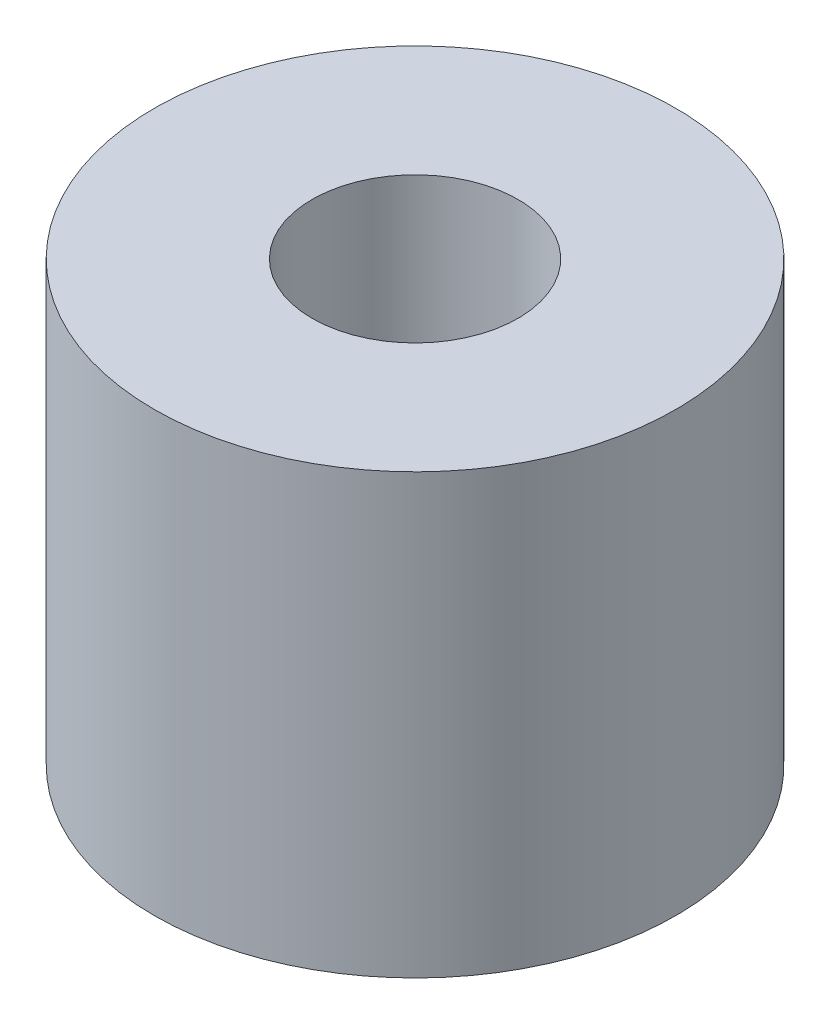
ISO-10303-21;
HEADER;
FILE_DESCRIPTION(('STEP AP214'),'2;1');
FILE_NAME('part.step','',(''),(''),'','','');
FILE_SCHEMA(('AUTOMOTIVE_DESIGN { 1 0 10303 214 1 1 1 1 }'));
ENDSEC;
DATA;
#1=APPLICATION_CONTEXT('core data for automotive mechanical design processes');
#2=APPLICATION_PROTOCOL_DEFINITION('international standard','automotive_design',2000,#1);
#3=PRODUCT_CONTEXT('',#1,'mechanical');
#4=PRODUCT('Part','Part','',(#3));
#5=PRODUCT_RELATED_PRODUCT_CATEGORY('part','',(#4));
#6=PRODUCT_DEFINITION_FORMATION('','',#4);
#7=PRODUCT_DEFINITION_CONTEXT('part definition',#1,'design');
#8=PRODUCT_DEFINITION('design','',#6,#7);
#9=PRODUCT_DEFINITION_SHAPE('','',#8);
#10=(LENGTH_UNIT() NAMED_UNIT(*) SI_UNIT(.MILLI.,.METRE.));
#11=(NAMED_UNIT(*) PLANE_ANGLE_UNIT() SI_UNIT($,.RADIAN.));
#12=(NAMED_UNIT(*) SI_UNIT($,.STERADIAN.) SOLID_ANGLE_UNIT());
#13=UNCERTAINTY_MEASURE_WITH_UNIT(LENGTH_MEASURE(1.E-05),#10,'distance_accuracy_value','');
#14=(GEOMETRIC_REPRESENTATION_CONTEXT(3) GLOBAL_UNCERTAINTY_ASSIGNED_CONTEXT((#13)) GLOBAL_UNIT_ASSIGNED_CONTEXT((#10,
#11,#12)) REPRESENTATION_CONTEXT('',''));
#15=CARTESIAN_POINT('',(0.,0.,0.));
#16=DIRECTION('',(0.,0.,1.));
#17=DIRECTION('',(1.,0.,0.));
#18=AXIS2_PLACEMENT_3D('',#15,#16,#17);
#19=CARTESIAN_POINT('',(0.,5.,0.));
#20=DIRECTION('',(0.,1.,0.));
#21=DIRECTION('',(0.,0.,1.));
#22=AXIS2_PLACEMENT_3D('',#19,#20,#21);
#23=PLANE('',#22);
#24=CARTESIAN_POINT('',(0.,5.,0.));
#25=DIRECTION('',(0.,1.,0.));
#26=DIRECTION('',(0.,0.,1.));
#27=AXIS2_PLACEMENT_3D('',#24,#25,#26);
#28=CIRCLE('',#27,2.975);
#29=CARTESIAN_POINT('',(0.,5.,2.975));
#30=VERTEX_POINT('',#29);
#31=EDGE_CURVE('E10',#30,#30,#28,.T.);
#32=ORIENTED_EDGE('',*,*,#31,.T.);
#33=EDGE_LOOP('',(#32));
#34=FACE_BOUND('',#33,.T.);
#35=CARTESIAN_POINT('',(0.,5.,0.));
#36=DIRECTION('',(0.,1.,0.));
#37=DIRECTION('',(0.,0.,1.));
#38=AXIS2_PLACEMENT_3D('',#35,#36,#37);
#39=CIRCLE('',#38,1.175);
#40=CARTESIAN_POINT('',(0.,5.,1.175));
#41=VERTEX_POINT('',#40);
#42=EDGE_CURVE('E50',#41,#41,#39,.T.);
#43=ORIENTED_EDGE('',*,*,#42,.F.);
#44=EDGE_LOOP('',(#43));
#45=FACE_BOUND('',#44,.T.);
#46=ADVANCED_FACE('F37',(#34,#45),#23,.T.);
#47=CARTESIAN_POINT('',(0.,0.,0.));
#48=DIRECTION('',(0.,1.,0.));
#49=DIRECTION('',(0.,0.,1.));
#50=AXIS2_PLACEMENT_3D('',#47,#48,#49);
#51=PLANE('',#50);
#52=CARTESIAN_POINT('',(0.,0.,0.));
#53=DIRECTION('',(0.,1.,0.));
#54=DIRECTION('',(0.,0.,1.));
#55=AXIS2_PLACEMENT_3D('',#52,#53,#54);
#56=CIRCLE('',#55,2.975);
#57=CARTESIAN_POINT('',(0.,0.,2.975));
#58=VERTEX_POINT('',#57);
#59=EDGE_CURVE('E41',#58,#58,#56,.T.);
#60=ORIENTED_EDGE('',*,*,#59,.F.);
#61=EDGE_LOOP('',(#60));
#62=FACE_BOUND('',#61,.T.);
#63=CARTESIAN_POINT('',(0.,0.,0.));
#64=DIRECTION('',(0.,1.,0.));
#65=DIRECTION('',(0.,0.,1.));
#66=AXIS2_PLACEMENT_3D('',#63,#64,#65);
#67=CIRCLE('',#66,1.175);
#68=CARTESIAN_POINT('',(0.,0.,1.175));
#69=VERTEX_POINT('',#68);
#70=EDGE_CURVE('E52',#69,#69,#67,.T.);
#71=ORIENTED_EDGE('',*,*,#70,.T.);
#72=EDGE_LOOP('',(#71));
#73=FACE_BOUND('',#72,.T.);
#74=ADVANCED_FACE('F64',(#62,#73),#51,.F.);
#75=CARTESIAN_POINT('',(0.,5.,0.));
#76=DIRECTION('',(0.,-1.,0.));
#77=DIRECTION('',(0.,0.,-1.));
#78=AXIS2_PLACEMENT_3D('',#75,#76,#77);
#79=CYLINDRICAL_SURFACE('',#78,2.975);
#80=ORIENTED_EDGE('',*,*,#31,.F.);
#81=EDGE_LOOP('',(#80));
#82=FACE_BOUND('',#81,.T.);
#83=ORIENTED_EDGE('',*,*,#59,.T.);
#84=EDGE_LOOP('',(#83));
#85=FACE_BOUND('',#84,.T.);
#86=ADVANCED_FACE('F39',(#82,#85),#79,.T.);
#87=CARTESIAN_POINT('',(0.,5.,0.));
#88=DIRECTION('',(0.,-1.,0.));
#89=DIRECTION('',(0.,0.,-1.));
#90=AXIS2_PLACEMENT_3D('',#87,#88,#89);
#91=CYLINDRICAL_SURFACE('',#90,1.175);
#92=ORIENTED_EDGE('',*,*,#42,.T.);
#93=EDGE_LOOP('',(#92));
#94=FACE_BOUND('',#93,.T.);
#95=ORIENTED_EDGE('',*,*,#70,.F.);
#96=EDGE_LOOP('',(#95));
#97=FACE_BOUND('',#96,.T.);
#98=ADVANCED_FACE('F60',(#94,#97),#91,.F.);
#99=CLOSED_SHELL('',(#46,#74,#86,#98));
#100=MANIFOLD_SOLID_BREP('B2',#99);
#101=ADVANCED_BREP_SHAPE_REPRESENTATION('',(#18,#100),#14);
#102=SHAPE_DEFINITION_REPRESENTATION(#9,#101);
ENDSEC;
END-ISO-10303-21;
